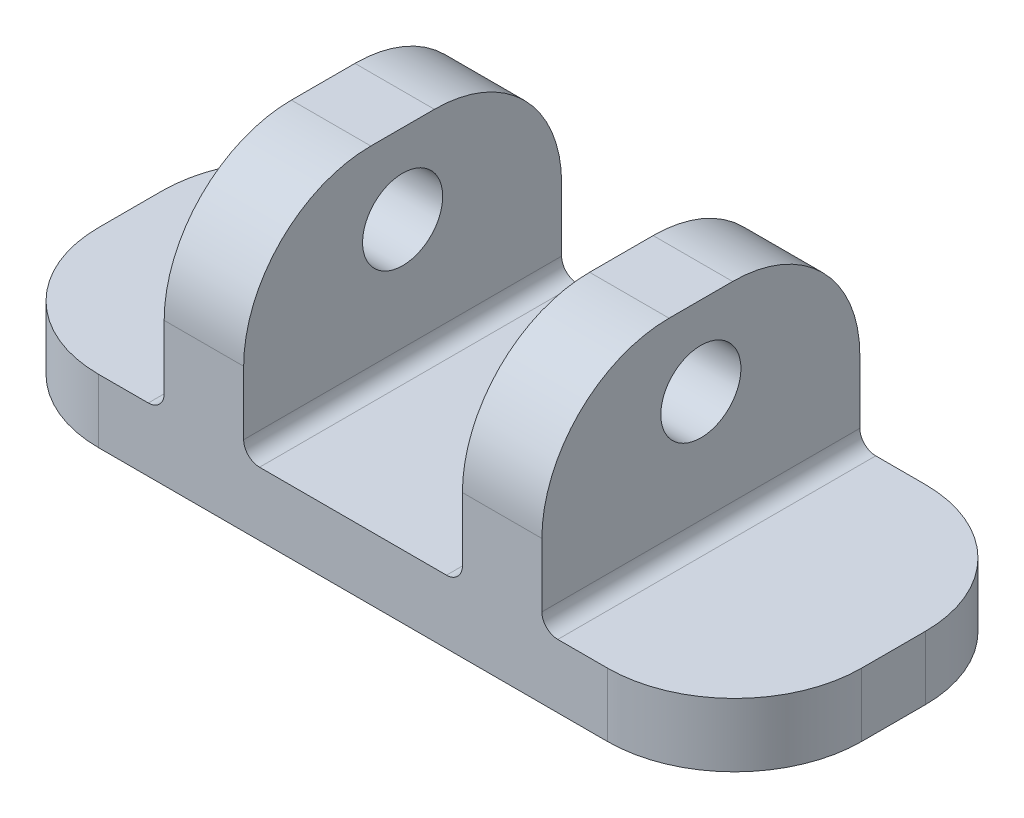
ISO-10303-21;
HEADER;
FILE_DESCRIPTION(('STEP AP214'),'2;1');
FILE_NAME('part.step','',(''),(''),'','','');
FILE_SCHEMA(('AUTOMOTIVE_DESIGN { 1 0 10303 214 1 1 1 1 }'));
ENDSEC;
DATA;
#1=APPLICATION_CONTEXT('core data for automotive mechanical design processes');
#2=APPLICATION_PROTOCOL_DEFINITION('international standard','automotive_design',2000,#1);
#3=PRODUCT_CONTEXT('',#1,'mechanical');
#4=PRODUCT('Part','Part','',(#3));
#5=PRODUCT_RELATED_PRODUCT_CATEGORY('part','',(#4));
#6=PRODUCT_DEFINITION_FORMATION('','',#4);
#7=PRODUCT_DEFINITION_CONTEXT('part definition',#1,'design');
#8=PRODUCT_DEFINITION('design','',#6,#7);
#9=PRODUCT_DEFINITION_SHAPE('','',#8);
#10=(LENGTH_UNIT() NAMED_UNIT(*) SI_UNIT(.MILLI.,.METRE.));
#11=(NAMED_UNIT(*) PLANE_ANGLE_UNIT() SI_UNIT($,.RADIAN.));
#12=(NAMED_UNIT(*) SI_UNIT($,.STERADIAN.) SOLID_ANGLE_UNIT());
#13=UNCERTAINTY_MEASURE_WITH_UNIT(LENGTH_MEASURE(1.E-05),#10,'distance_accuracy_value','');
#14=(GEOMETRIC_REPRESENTATION_CONTEXT(3) GLOBAL_UNCERTAINTY_ASSIGNED_CONTEXT((#13)) GLOBAL_UNIT_ASSIGNED_CONTEXT((#10,
#11,#12)) REPRESENTATION_CONTEXT('',''));
#15=CARTESIAN_POINT('',(0.,0.,0.));
#16=DIRECTION('',(0.,0.,1.));
#17=DIRECTION('',(1.,0.,0.));
#18=AXIS2_PLACEMENT_3D('',#15,#16,#17);
#19=CARTESIAN_POINT('',(10.922,7.9375,15.875));
#20=DIRECTION('',(1.,0.,0.));
#21=DIRECTION('',(0.,1.,0.));
#22=AXIS2_PLACEMENT_3D('',#19,#20,#21);
#23=PLANE('',#22);
#24=CARTESIAN_POINT('',(10.922,0.,0.));
#25=DIRECTION('',(1.,0.,0.));
#26=DIRECTION('',(0.,1.,0.));
#27=AXIS2_PLACEMENT_3D('',#24,#25,#26);
#28=CIRCLE('',#27,4.);
#29=CARTESIAN_POINT('',(10.922,4.,0.));
#30=VERTEX_POINT('',#29);
#31=EDGE_CURVE('E353',#30,#30,#28,.T.);
#32=ORIENTED_EDGE('',*,*,#31,.T.);
#33=EDGE_LOOP('',(#32));
#34=FACE_BOUND('',#33,.T.);
#35=DIRECTION('',(0.,-1.,0.));
#36=VECTOR('',#35,1.);
#37=CARTESIAN_POINT('',(10.922,7.9375,-15.875));
#38=LINE('',#37,#36);
#39=CARTESIAN_POINT('',(10.922,-4.7625,-15.875));
#40=VERTEX_POINT('',#39);
#41=CARTESIAN_POINT('',(10.922,-11.1125,-15.875));
#42=VERTEX_POINT('',#41);
#43=EDGE_CURVE('E349',#40,#42,#38,.T.);
#44=ORIENTED_EDGE('',*,*,#43,.T.);
#45=DIRECTION('',(0.,0.,-1.));
#46=VECTOR('',#45,1.);
#47=CARTESIAN_POINT('',(10.922,-11.1125,15.875));
#48=LINE('',#47,#46);
#49=CARTESIAN_POINT('',(10.922,-11.1125,15.875));
#50=VERTEX_POINT('',#49);
#51=EDGE_CURVE('E274',#42,#50,#48,.F.);
#52=ORIENTED_EDGE('',*,*,#51,.T.);
#53=DIRECTION('',(0.,-1.,0.));
#54=VECTOR('',#53,1.);
#55=CARTESIAN_POINT('',(10.922,7.9375,15.875));
#56=LINE('',#55,#54);
#57=CARTESIAN_POINT('',(10.922,-4.7625,15.875));
#58=VERTEX_POINT('',#57);
#59=EDGE_CURVE('E370',#58,#50,#56,.T.);
#60=ORIENTED_EDGE('',*,*,#59,.F.);
#61=CARTESIAN_POINT('',(10.922,-4.7625,3.175));
#62=DIRECTION('',(1.,0.,0.));
#63=DIRECTION('',(0.,1.,0.));
#64=AXIS2_PLACEMENT_3D('',#61,#62,#63);
#65=CIRCLE('',#64,12.7);
#66=CARTESIAN_POINT('',(10.922,7.9375,3.175));
#67=VERTEX_POINT('',#66);
#68=EDGE_CURVE('E249',#58,#67,#65,.F.);
#69=ORIENTED_EDGE('',*,*,#68,.T.);
#70=DIRECTION('',(0.,0.,-1.));
#71=VECTOR('',#70,1.);
#72=CARTESIAN_POINT('',(10.922,7.9375,15.875));
#73=LINE('',#72,#71);
#74=CARTESIAN_POINT('',(10.922,7.9375,-3.175));
#75=VERTEX_POINT('',#74);
#76=EDGE_CURVE('E348',#67,#75,#73,.T.);
#77=ORIENTED_EDGE('',*,*,#76,.T.);
#78=CARTESIAN_POINT('',(10.922,-4.7625,-3.175));
#79=DIRECTION('',(1.,0.,0.));
#80=DIRECTION('',(0.,1.,0.));
#81=AXIS2_PLACEMENT_3D('',#78,#79,#80);
#82=CIRCLE('',#81,12.7);
#83=EDGE_CURVE('E251',#75,#40,#82,.F.);
#84=ORIENTED_EDGE('',*,*,#83,.T.);
#85=EDGE_LOOP('',(#44,#52,#60,#69,#77,#84));
#86=FACE_BOUND('',#85,.T.);
#87=ADVANCED_FACE('F33',(#34,#86),#23,.F.);
#88=CARTESIAN_POINT('',(10.922,-12.7,15.875));
#89=DIRECTION('',(0.,-1.,0.));
#90=DIRECTION('',(0.,0.,-1.));
#91=AXIS2_PLACEMENT_3D('',#88,#89,#90);
#92=PLANE('',#91);
#93=DIRECTION('',(-1.,0.,0.));
#94=VECTOR('',#93,1.);
#95=CARTESIAN_POINT('',(10.922,-12.7,15.875));
#96=LINE('',#95,#94);
#97=CARTESIAN_POINT('',(9.3345,-12.7,15.875));
#98=VERTEX_POINT('',#97);
#99=CARTESIAN_POINT('',(-9.3345,-12.7,15.875));
#100=VERTEX_POINT('',#99);
#101=EDGE_CURVE('E430',#98,#100,#96,.T.);
#102=ORIENTED_EDGE('',*,*,#101,.F.);
#103=DIRECTION('',(0.,0.,-1.));
#104=VECTOR('',#103,1.);
#105=CARTESIAN_POINT('',(9.3345,-12.7,-15.875));
#106=LINE('',#105,#104);
#107=CARTESIAN_POINT('',(9.3345,-12.7,-15.875));
#108=VERTEX_POINT('',#107);
#109=EDGE_CURVE('E271',#98,#108,#106,.T.);
#110=ORIENTED_EDGE('',*,*,#109,.T.);
#111=DIRECTION('',(-1.,0.,0.));
#112=VECTOR('',#111,1.);
#113=CARTESIAN_POINT('',(10.922,-12.7,-15.875));
#114=LINE('',#113,#112);
#115=CARTESIAN_POINT('',(-9.3345,-12.7,-15.875));
#116=VERTEX_POINT('',#115);
#117=EDGE_CURVE('E352',#108,#116,#114,.T.);
#118=ORIENTED_EDGE('',*,*,#117,.T.);
#119=DIRECTION('',(0.,0.,-1.));
#120=VECTOR('',#119,1.);
#121=CARTESIAN_POINT('',(-9.3345,-12.7,15.875));
#122=LINE('',#121,#120);
#123=EDGE_CURVE('E269',#116,#100,#122,.F.);
#124=ORIENTED_EDGE('',*,*,#123,.T.);
#125=EDGE_LOOP('',(#102,#110,#118,#124));
#126=FACE_BOUND('',#125,.T.);
#127=ADVANCED_FACE('F461',(#126),#92,.F.);
#128=CARTESIAN_POINT('',(-10.922,7.9375,15.875));
#129=DIRECTION('',(-1.,0.,0.));
#130=DIRECTION('',(0.,-1.,0.));
#131=AXIS2_PLACEMENT_3D('',#128,#129,#130);
#132=PLANE('',#131);
#133=CARTESIAN_POINT('',(-10.922,0.,0.));
#134=DIRECTION('',(-1.,0.,0.));
#135=DIRECTION('',(0.,-1.,0.));
#136=AXIS2_PLACEMENT_3D('',#133,#134,#135);
#137=CIRCLE('',#136,4.);
#138=CARTESIAN_POINT('',(-10.922,-4.,0.));
#139=VERTEX_POINT('',#138);
#140=EDGE_CURVE('E707',#139,#139,#137,.T.);
#141=ORIENTED_EDGE('',*,*,#140,.T.);
#142=EDGE_LOOP('',(#141));
#143=FACE_BOUND('',#142,.T.);
#144=DIRECTION('',(0.,1.,0.));
#145=VECTOR('',#144,1.);
#146=CARTESIAN_POINT('',(-10.922,7.9375,15.875));
#147=LINE('',#146,#145);
#148=CARTESIAN_POINT('',(-10.922,-11.1125,15.875));
#149=VERTEX_POINT('',#148);
#150=CARTESIAN_POINT('',(-10.922,-4.7625,15.875));
#151=VERTEX_POINT('',#150);
#152=EDGE_CURVE('E433',#149,#151,#147,.T.);
#153=ORIENTED_EDGE('',*,*,#152,.F.);
#154=DIRECTION('',(0.,0.,-1.));
#155=VECTOR('',#154,1.);
#156=CARTESIAN_POINT('',(-10.922,-11.1125,-15.875));
#157=LINE('',#156,#155);
#158=CARTESIAN_POINT('',(-10.922,-11.1125,-15.875));
#159=VERTEX_POINT('',#158);
#160=EDGE_CURVE('E276',#149,#159,#157,.T.);
#161=ORIENTED_EDGE('',*,*,#160,.T.);
#162=DIRECTION('',(0.,1.,0.));
#163=VECTOR('',#162,1.);
#164=CARTESIAN_POINT('',(-10.922,7.9375,-15.875));
#165=LINE('',#164,#163);
#166=CARTESIAN_POINT('',(-10.922,-4.7625,-15.875));
#167=VERTEX_POINT('',#166);
#168=EDGE_CURVE('E356',#159,#167,#165,.T.);
#169=ORIENTED_EDGE('',*,*,#168,.T.);
#170=CARTESIAN_POINT('',(-10.922,-4.7625,-3.175));
#171=DIRECTION('',(-1.,0.,0.));
#172=DIRECTION('',(0.,-1.,0.));
#173=AXIS2_PLACEMENT_3D('',#170,#171,#172);
#174=CIRCLE('',#173,12.7);
#175=CARTESIAN_POINT('',(-10.922,7.9375,-3.175));
#176=VERTEX_POINT('',#175);
#177=EDGE_CURVE('E237',#167,#176,#174,.F.);
#178=ORIENTED_EDGE('',*,*,#177,.T.);
#179=DIRECTION('',(0.,0.,-1.));
#180=VECTOR('',#179,1.);
#181=CARTESIAN_POINT('',(-10.922,7.9375,15.875));
#182=LINE('',#181,#180);
#183=CARTESIAN_POINT('',(-10.922,7.9375,3.175));
#184=VERTEX_POINT('',#183);
#185=EDGE_CURVE('E216',#184,#176,#182,.T.);
#186=ORIENTED_EDGE('',*,*,#185,.F.);
#187=CARTESIAN_POINT('',(-10.922,-4.7625,3.175));
#188=DIRECTION('',(-1.,0.,0.));
#189=DIRECTION('',(0.,-1.,0.));
#190=AXIS2_PLACEMENT_3D('',#187,#188,#189);
#191=CIRCLE('',#190,12.7);
#192=EDGE_CURVE('E222',#184,#151,#191,.F.);
#193=ORIENTED_EDGE('',*,*,#192,.T.);
#194=EDGE_LOOP('',(#153,#161,#169,#178,#186,#193));
#195=FACE_BOUND('',#194,.T.);
#196=ADVANCED_FACE('F453',(#143,#195),#132,.F.);
#197=CARTESIAN_POINT('',(-10.922,7.9375,15.875));
#198=DIRECTION('',(0.,-1.,0.));
#199=DIRECTION('',(0.,0.,-1.));
#200=AXIS2_PLACEMENT_3D('',#197,#198,#199);
#201=PLANE('',#200);
#202=ORIENTED_EDGE('',*,*,#185,.T.);
#203=DIRECTION('',(-1.,0.,0.));
#204=VECTOR('',#203,1.);
#205=CARTESIAN_POINT('',(-18.8595,7.9375,-3.175));
#206=LINE('',#205,#204);
#207=CARTESIAN_POINT('',(-18.8595,7.9375,-3.175));
#208=VERTEX_POINT('',#207);
#209=EDGE_CURVE('E207',#176,#208,#206,.T.);
#210=ORIENTED_EDGE('',*,*,#209,.T.);
#211=DIRECTION('',(0.,0.,-1.));
#212=VECTOR('',#211,1.);
#213=CARTESIAN_POINT('',(-18.8595,7.9375,15.875));
#214=LINE('',#213,#212);
#215=CARTESIAN_POINT('',(-18.8595,7.9375,3.175));
#216=VERTEX_POINT('',#215);
#217=EDGE_CURVE('E199',#216,#208,#214,.T.);
#218=ORIENTED_EDGE('',*,*,#217,.F.);
#219=DIRECTION('',(-1.,0.,0.));
#220=VECTOR('',#219,1.);
#221=CARTESIAN_POINT('',(-10.922,7.9375,3.175));
#222=LINE('',#221,#220);
#223=EDGE_CURVE('E213',#216,#184,#222,.F.);
#224=ORIENTED_EDGE('',*,*,#223,.T.);
#225=EDGE_LOOP('',(#202,#210,#218,#224));
#226=FACE_BOUND('',#225,.T.);
#227=ADVANCED_FACE('F212',(#226),#201,.F.);
#228=CARTESIAN_POINT('',(-18.8595,7.9375,15.875));
#229=DIRECTION('',(1.,0.,0.));
#230=DIRECTION('',(0.,0.,-1.));
#231=AXIS2_PLACEMENT_3D('',#228,#229,#230);
#232=PLANE('',#231);
#233=CARTESIAN_POINT('',(-18.8595,0.,0.));
#234=DIRECTION('',(1.,0.,0.));
#235=DIRECTION('',(0.,0.,-1.));
#236=AXIS2_PLACEMENT_3D('',#233,#234,#235);
#237=CIRCLE('',#236,4.);
#238=CARTESIAN_POINT('',(-18.8595,0.,-4.));
#239=VERTEX_POINT('',#238);
#240=EDGE_CURVE('E709',#239,#239,#237,.T.);
#241=ORIENTED_EDGE('',*,*,#240,.T.);
#242=EDGE_LOOP('',(#241));
#243=FACE_BOUND('',#242,.T.);
#244=DIRECTION('',(0.,-1.,0.));
#245=VECTOR('',#244,1.);
#246=CARTESIAN_POINT('',(-18.8595,7.9375,-15.875));
#247=LINE('',#246,#245);
#248=CARTESIAN_POINT('',(-18.8595,-4.7625,-15.875));
#249=VERTEX_POINT('',#248);
#250=CARTESIAN_POINT('',(-18.8595,-11.1125,-15.875));
#251=VERTEX_POINT('',#250);
#252=EDGE_CURVE('E358',#249,#251,#247,.T.);
#253=ORIENTED_EDGE('',*,*,#252,.T.);
#254=DIRECTION('',(0.,0.,-1.));
#255=VECTOR('',#254,1.);
#256=CARTESIAN_POINT('',(-18.8595,-11.1125,15.875));
#257=LINE('',#256,#255);
#258=CARTESIAN_POINT('',(-18.8595,-11.1125,15.875));
#259=VERTEX_POINT('',#258);
#260=EDGE_CURVE('E261',#251,#259,#257,.F.);
#261=ORIENTED_EDGE('',*,*,#260,.T.);
#262=DIRECTION('',(0.,-1.,0.));
#263=VECTOR('',#262,1.);
#264=CARTESIAN_POINT('',(-18.8595,7.9375,15.875));
#265=LINE('',#264,#263);
#266=CARTESIAN_POINT('',(-18.8595,-4.7625,15.875));
#267=VERTEX_POINT('',#266);
#268=EDGE_CURVE('E201',#267,#259,#265,.T.);
#269=ORIENTED_EDGE('',*,*,#268,.F.);
#270=CARTESIAN_POINT('',(-18.8595,-4.7625,3.175));
#271=DIRECTION('',(1.,0.,0.));
#272=DIRECTION('',(0.,0.,-1.));
#273=AXIS2_PLACEMENT_3D('',#270,#271,#272);
#274=CIRCLE('',#273,12.7);
#275=EDGE_CURVE('E195',#267,#216,#274,.F.);
#276=ORIENTED_EDGE('',*,*,#275,.T.);
#277=ORIENTED_EDGE('',*,*,#217,.T.);
#278=CARTESIAN_POINT('',(-18.8595,-4.7625,-3.175));
#279=DIRECTION('',(1.,0.,0.));
#280=DIRECTION('',(0.,0.,-1.));
#281=AXIS2_PLACEMENT_3D('',#278,#279,#280);
#282=CIRCLE('',#281,12.7);
#283=EDGE_CURVE('E206',#208,#249,#282,.F.);
#284=ORIENTED_EDGE('',*,*,#283,.T.);
#285=EDGE_LOOP('',(#253,#261,#269,#276,#277,#284));
#286=FACE_BOUND('',#285,.T.);
#287=ADVANCED_FACE('F198',(#243,#286),#232,.F.);
#288=CARTESIAN_POINT('',(-18.8595,-12.7,15.875));
#289=DIRECTION('',(0.,-1.,0.));
#290=DIRECTION('',(1.,0.,0.));
#291=AXIS2_PLACEMENT_3D('',#288,#289,#290);
#292=PLANE('',#291);
#293=DIRECTION('',(-1.,0.,0.));
#294=VECTOR('',#293,1.);
#295=CARTESIAN_POINT('',(-18.8595,-12.7,-15.875));
#296=LINE('',#295,#294);
#297=CARTESIAN_POINT('',(-20.447,-12.7,-15.875));
#298=VERTEX_POINT('',#297);
#299=CARTESIAN_POINT('',(-25.4,-12.7,-15.875));
#300=VERTEX_POINT('',#299);
#301=EDGE_CURVE('E360',#298,#300,#296,.T.);
#302=ORIENTED_EDGE('',*,*,#301,.T.);
#303=CARTESIAN_POINT('',(-25.4,-12.7,-3.175));
#304=DIRECTION('',(0.,-1.,0.));
#305=DIRECTION('',(1.,0.,0.));
#306=AXIS2_PLACEMENT_3D('',#303,#304,#305);
#307=CIRCLE('',#306,12.7);
#308=CARTESIAN_POINT('',(-38.1,-12.7,-3.175));
#309=VERTEX_POINT('',#308);
#310=EDGE_CURVE('E315',#300,#309,#307,.F.);
#311=ORIENTED_EDGE('',*,*,#310,.T.);
#312=DIRECTION('',(0.,0.,-1.));
#313=VECTOR('',#312,1.);
#314=CARTESIAN_POINT('',(-38.1,-12.7,15.875));
#315=LINE('',#314,#313);
#316=CARTESIAN_POINT('',(-38.1,-12.7,3.175));
#317=VERTEX_POINT('',#316);
#318=EDGE_CURVE('E217',#317,#309,#315,.T.);
#319=ORIENTED_EDGE('',*,*,#318,.F.);
#320=CARTESIAN_POINT('',(-25.4,-12.7,3.175));
#321=DIRECTION('',(0.,-1.,0.));
#322=DIRECTION('',(1.,0.,0.));
#323=AXIS2_PLACEMENT_3D('',#320,#321,#322);
#324=CIRCLE('',#323,12.7);
#325=CARTESIAN_POINT('',(-25.4,-12.7,15.875));
#326=VERTEX_POINT('',#325);
#327=EDGE_CURVE('E313',#317,#326,#324,.F.);
#328=ORIENTED_EDGE('',*,*,#327,.T.);
#329=DIRECTION('',(-1.,0.,0.));
#330=VECTOR('',#329,1.);
#331=CARTESIAN_POINT('',(-18.8595,-12.7,15.875));
#332=LINE('',#331,#330);
#333=CARTESIAN_POINT('',(-20.447,-12.7,15.875));
#334=VERTEX_POINT('',#333);
#335=EDGE_CURVE('E331',#334,#326,#332,.T.);
#336=ORIENTED_EDGE('',*,*,#335,.F.);
#337=DIRECTION('',(0.,0.,-1.));
#338=VECTOR('',#337,1.);
#339=CARTESIAN_POINT('',(-20.447,-12.7,-15.875));
#340=LINE('',#339,#338);
#341=EDGE_CURVE('E258',#334,#298,#340,.T.);
#342=ORIENTED_EDGE('',*,*,#341,.T.);
#343=EDGE_LOOP('',(#302,#311,#319,#328,#336,#342));
#344=FACE_BOUND('',#343,.T.);
#345=ADVANCED_FACE('F443',(#344),#292,.F.);
#346=CARTESIAN_POINT('',(-38.1,-12.7,15.875));
#347=DIRECTION('',(1.,0.,0.));
#348=DIRECTION('',(0.,1.,0.));
#349=AXIS2_PLACEMENT_3D('',#346,#347,#348);
#350=PLANE('',#349);
#351=ORIENTED_EDGE('',*,*,#318,.T.);
#352=DIRECTION('',(0.,-1.,0.));
#353=VECTOR('',#352,1.);
#354=CARTESIAN_POINT('',(-38.1,-19.05,-3.175));
#355=LINE('',#354,#353);
#356=CARTESIAN_POINT('',(-38.1,-19.05,-3.175));
#357=VERTEX_POINT('',#356);
#358=EDGE_CURVE('E298',#309,#357,#355,.T.);
#359=ORIENTED_EDGE('',*,*,#358,.T.);
#360=DIRECTION('',(0.,0.,-1.));
#361=VECTOR('',#360,1.);
#362=CARTESIAN_POINT('',(-38.1,-19.05,15.875));
#363=LINE('',#362,#361);
#364=CARTESIAN_POINT('',(-38.1,-19.05,3.175));
#365=VERTEX_POINT('',#364);
#366=EDGE_CURVE('E382',#365,#357,#363,.T.);
#367=ORIENTED_EDGE('',*,*,#366,.F.);
#368=DIRECTION('',(0.,-1.,0.));
#369=VECTOR('',#368,1.);
#370=CARTESIAN_POINT('',(-38.1,-12.7,3.175));
#371=LINE('',#370,#369);
#372=EDGE_CURVE('E296',#365,#317,#371,.F.);
#373=ORIENTED_EDGE('',*,*,#372,.T.);
#374=EDGE_LOOP('',(#351,#359,#367,#373));
#375=FACE_BOUND('',#374,.T.);
#376=ADVANCED_FACE('F388',(#375),#350,.F.);
#377=CARTESIAN_POINT('',(38.1,-19.05,15.875));
#378=DIRECTION('',(0.,1.,0.));
#379=DIRECTION('',(0.,0.,1.));
#380=AXIS2_PLACEMENT_3D('',#377,#378,#379);
#381=PLANE('',#380);
#382=ORIENTED_EDGE('',*,*,#366,.T.);
#383=CARTESIAN_POINT('',(-25.4,-19.05,-3.175));
#384=DIRECTION('',(0.,1.,0.));
#385=DIRECTION('',(0.,0.,1.));
#386=AXIS2_PLACEMENT_3D('',#383,#384,#385);
#387=CIRCLE('',#386,12.7);
#388=CARTESIAN_POINT('',(-25.4,-19.05,-15.875));
#389=VERTEX_POINT('',#388);
#390=EDGE_CURVE('E307',#357,#389,#387,.F.);
#391=ORIENTED_EDGE('',*,*,#390,.T.);
#392=DIRECTION('',(1.,0.,0.));
#393=VECTOR('',#392,1.);
#394=CARTESIAN_POINT('',(38.1,-19.05,-15.875));
#395=LINE('',#394,#393);
#396=CARTESIAN_POINT('',(25.4,-19.05,-15.875));
#397=VERTEX_POINT('',#396);
#398=EDGE_CURVE('E363',#389,#397,#395,.T.);
#399=ORIENTED_EDGE('',*,*,#398,.T.);
#400=CARTESIAN_POINT('',(25.4,-19.05,-3.175));
#401=DIRECTION('',(0.,1.,0.));
#402=DIRECTION('',(0.,0.,1.));
#403=AXIS2_PLACEMENT_3D('',#400,#401,#402);
#404=CIRCLE('',#403,12.7);
#405=CARTESIAN_POINT('',(38.1,-19.05,-3.175));
#406=VERTEX_POINT('',#405);
#407=EDGE_CURVE('E305',#397,#406,#404,.F.);
#408=ORIENTED_EDGE('',*,*,#407,.T.);
#409=DIRECTION('',(0.,0.,-1.));
#410=VECTOR('',#409,1.);
#411=CARTESIAN_POINT('',(38.1,-19.05,15.875));
#412=LINE('',#411,#410);
#413=CARTESIAN_POINT('',(38.1,-19.05,3.175));
#414=VERTEX_POINT('',#413);
#415=EDGE_CURVE('E379',#414,#406,#412,.T.);
#416=ORIENTED_EDGE('',*,*,#415,.F.);
#417=CARTESIAN_POINT('',(25.4,-19.05,3.175));
#418=DIRECTION('',(0.,1.,0.));
#419=DIRECTION('',(0.,0.,1.));
#420=AXIS2_PLACEMENT_3D('',#417,#418,#419);
#421=CIRCLE('',#420,12.7);
#422=CARTESIAN_POINT('',(25.4,-19.05,15.875));
#423=VERTEX_POINT('',#422);
#424=EDGE_CURVE('E303',#414,#423,#421,.F.);
#425=ORIENTED_EDGE('',*,*,#424,.T.);
#426=DIRECTION('',(1.,0.,0.));
#427=VECTOR('',#426,1.);
#428=CARTESIAN_POINT('',(38.1,-19.05,15.875));
#429=LINE('',#428,#427);
#430=CARTESIAN_POINT('',(-25.4,-19.05,15.875));
#431=VERTEX_POINT('',#430);
#432=EDGE_CURVE('E329',#431,#423,#429,.T.);
#433=ORIENTED_EDGE('',*,*,#432,.F.);
#434=CARTESIAN_POINT('',(-25.4,-19.05,3.175));
#435=DIRECTION('',(0.,1.,0.));
#436=DIRECTION('',(0.,0.,1.));
#437=AXIS2_PLACEMENT_3D('',#434,#435,#436);
#438=CIRCLE('',#437,12.7);
#439=EDGE_CURVE('E301',#431,#365,#438,.F.);
#440=ORIENTED_EDGE('',*,*,#439,.T.);
#441=EDGE_LOOP('',(#382,#391,#399,#408,#416,#425,#433,#440));
#442=FACE_BOUND('',#441,.T.);
#443=ADVANCED_FACE('F336',(#442),#381,.F.);
#444=CARTESIAN_POINT('',(38.1,-12.7,15.875));
#445=DIRECTION('',(-1.,0.,0.));
#446=DIRECTION('',(0.,-1.,0.));
#447=AXIS2_PLACEMENT_3D('',#444,#445,#446);
#448=PLANE('',#447);
#449=ORIENTED_EDGE('',*,*,#415,.T.);
#450=DIRECTION('',(0.,1.,0.));
#451=VECTOR('',#450,1.);
#452=CARTESIAN_POINT('',(38.1,-12.7,-3.175));
#453=LINE('',#452,#451);
#454=CARTESIAN_POINT('',(38.1,-12.7,-3.175));
#455=VERTEX_POINT('',#454);
#456=EDGE_CURVE('E319',#406,#455,#453,.T.);
#457=ORIENTED_EDGE('',*,*,#456,.T.);
#458=DIRECTION('',(0.,0.,-1.));
#459=VECTOR('',#458,1.);
#460=CARTESIAN_POINT('',(38.1,-12.7,15.875));
#461=LINE('',#460,#459);
#462=CARTESIAN_POINT('',(38.1,-12.7,3.175));
#463=VERTEX_POINT('',#462);
#464=EDGE_CURVE('E376',#463,#455,#461,.T.);
#465=ORIENTED_EDGE('',*,*,#464,.F.);
#466=DIRECTION('',(0.,1.,0.));
#467=VECTOR('',#466,1.);
#468=CARTESIAN_POINT('',(38.1,-12.7,3.175));
#469=LINE('',#468,#467);
#470=EDGE_CURVE('E317',#463,#414,#469,.F.);
#471=ORIENTED_EDGE('',*,*,#470,.T.);
#472=EDGE_LOOP('',(#449,#457,#465,#471));
#473=FACE_BOUND('',#472,.T.);
#474=ADVANCED_FACE('F403',(#473),#448,.F.);
#475=CARTESIAN_POINT('',(18.8595,-12.7,15.875));
#476=DIRECTION('',(0.,-1.,0.));
#477=DIRECTION('',(1.,0.,0.));
#478=AXIS2_PLACEMENT_3D('',#475,#476,#477);
#479=PLANE('',#478);
#480=ORIENTED_EDGE('',*,*,#464,.T.);
#481=CARTESIAN_POINT('',(25.4,-12.7,-3.175));
#482=DIRECTION('',(0.,-1.,0.));
#483=DIRECTION('',(1.,0.,0.));
#484=AXIS2_PLACEMENT_3D('',#481,#482,#483);
#485=CIRCLE('',#484,12.7);
#486=CARTESIAN_POINT('',(25.4,-12.7,-15.875));
#487=VERTEX_POINT('',#486);
#488=EDGE_CURVE('E55',#455,#487,#485,.F.);
#489=ORIENTED_EDGE('',*,*,#488,.T.);
#490=DIRECTION('',(-1.,0.,0.));
#491=VECTOR('',#490,1.);
#492=CARTESIAN_POINT('',(18.8595,-12.7,-15.875));
#493=LINE('',#492,#491);
#494=CARTESIAN_POINT('',(20.447,-12.7,-15.875));
#495=VERTEX_POINT('',#494);
#496=EDGE_CURVE('E366',#487,#495,#493,.T.);
#497=ORIENTED_EDGE('',*,*,#496,.T.);
#498=DIRECTION('',(0.,0.,-1.));
#499=VECTOR('',#498,1.);
#500=CARTESIAN_POINT('',(20.447,-12.7,15.875));
#501=LINE('',#500,#499);
#502=CARTESIAN_POINT('',(20.447,-12.7,15.875));
#503=VERTEX_POINT('',#502);
#504=EDGE_CURVE('E266',#495,#503,#501,.F.);
#505=ORIENTED_EDGE('',*,*,#504,.T.);
#506=DIRECTION('',(-1.,0.,0.));
#507=VECTOR('',#506,1.);
#508=CARTESIAN_POINT('',(18.8595,-12.7,15.875));
#509=LINE('',#508,#507);
#510=CARTESIAN_POINT('',(25.4,-12.7,15.875));
#511=VERTEX_POINT('',#510);
#512=EDGE_CURVE('E340',#511,#503,#509,.T.);
#513=ORIENTED_EDGE('',*,*,#512,.F.);
#514=CARTESIAN_POINT('',(25.4,-12.7,3.175));
#515=DIRECTION('',(0.,-1.,0.));
#516=DIRECTION('',(1.,0.,0.));
#517=AXIS2_PLACEMENT_3D('',#514,#515,#516);
#518=CIRCLE('',#517,12.7);
#519=EDGE_CURVE('E48',#511,#463,#518,.F.);
#520=ORIENTED_EDGE('',*,*,#519,.T.);
#521=EDGE_LOOP('',(#480,#489,#497,#505,#513,#520));
#522=FACE_BOUND('',#521,.T.);
#523=ADVANCED_FACE('F408',(#522),#479,.F.);
#524=CARTESIAN_POINT('',(18.8595,7.9375,15.875));
#525=DIRECTION('',(-1.,0.,0.));
#526=DIRECTION('',(0.,0.,1.));
#527=AXIS2_PLACEMENT_3D('',#524,#525,#526);
#528=PLANE('',#527);
#529=CARTESIAN_POINT('',(18.8595,0.,0.));
#530=DIRECTION('',(-1.,0.,0.));
#531=DIRECTION('',(0.,0.,1.));
#532=AXIS2_PLACEMENT_3D('',#529,#530,#531);
#533=CIRCLE('',#532,4.);
#534=CARTESIAN_POINT('',(18.8595,0.,4.));
#535=VERTEX_POINT('',#534);
#536=EDGE_CURVE('E227',#535,#535,#533,.T.);
#537=ORIENTED_EDGE('',*,*,#536,.T.);
#538=EDGE_LOOP('',(#537));
#539=FACE_BOUND('',#538,.T.);
#540=DIRECTION('',(0.,1.,0.));
#541=VECTOR('',#540,1.);
#542=CARTESIAN_POINT('',(18.8595,7.9375,15.875));
#543=LINE('',#542,#541);
#544=CARTESIAN_POINT('',(18.8595,-11.1125,15.875));
#545=VERTEX_POINT('',#544);
#546=CARTESIAN_POINT('',(18.8595,-4.7625,15.875));
#547=VERTEX_POINT('',#546);
#548=EDGE_CURVE('E342',#545,#547,#543,.T.);
#549=ORIENTED_EDGE('',*,*,#548,.F.);
#550=DIRECTION('',(0.,0.,-1.));
#551=VECTOR('',#550,1.);
#552=CARTESIAN_POINT('',(18.8595,-11.1125,-15.875));
#553=LINE('',#552,#551);
#554=CARTESIAN_POINT('',(18.8595,-11.1125,-15.875));
#555=VERTEX_POINT('',#554);
#556=EDGE_CURVE('E263',#545,#555,#553,.T.);
#557=ORIENTED_EDGE('',*,*,#556,.T.);
#558=DIRECTION('',(0.,1.,0.));
#559=VECTOR('',#558,1.);
#560=CARTESIAN_POINT('',(18.8595,7.9375,-15.875));
#561=LINE('',#560,#559);
#562=CARTESIAN_POINT('',(18.8595,-4.7625,-15.875));
#563=VERTEX_POINT('',#562);
#564=EDGE_CURVE('E368',#555,#563,#561,.T.);
#565=ORIENTED_EDGE('',*,*,#564,.T.);
#566=CARTESIAN_POINT('',(18.8595,-4.7625,-3.175));
#567=DIRECTION('',(-1.,0.,0.));
#568=DIRECTION('',(0.,0.,1.));
#569=AXIS2_PLACEMENT_3D('',#566,#567,#568);
#570=CIRCLE('',#569,12.7);
#571=CARTESIAN_POINT('',(18.8595,7.9375,-3.175));
#572=VERTEX_POINT('',#571);
#573=EDGE_CURVE('E256',#563,#572,#570,.F.);
#574=ORIENTED_EDGE('',*,*,#573,.T.);
#575=DIRECTION('',(0.,0.,-1.));
#576=VECTOR('',#575,1.);
#577=CARTESIAN_POINT('',(18.8595,7.9375,15.875));
#578=LINE('',#577,#576);
#579=CARTESIAN_POINT('',(18.8595,7.9375,3.175));
#580=VERTEX_POINT('',#579);
#581=EDGE_CURVE('E373',#580,#572,#578,.T.);
#582=ORIENTED_EDGE('',*,*,#581,.F.);
#583=CARTESIAN_POINT('',(18.8595,-4.7625,3.175));
#584=DIRECTION('',(-1.,0.,0.));
#585=DIRECTION('',(0.,0.,1.));
#586=AXIS2_PLACEMENT_3D('',#583,#584,#585);
#587=CIRCLE('',#586,12.7);
#588=EDGE_CURVE('E253',#580,#547,#587,.F.);
#589=ORIENTED_EDGE('',*,*,#588,.T.);
#590=EDGE_LOOP('',(#549,#557,#565,#574,#582,#589));
#591=FACE_BOUND('',#590,.T.);
#592=ADVANCED_FACE('F416',(#539,#591),#528,.F.);
#593=CARTESIAN_POINT('',(10.922,7.9375,15.875));
#594=DIRECTION('',(0.,-1.,0.));
#595=DIRECTION('',(0.,0.,-1.));
#596=AXIS2_PLACEMENT_3D('',#593,#594,#595);
#597=PLANE('',#596);
#598=ORIENTED_EDGE('',*,*,#581,.T.);
#599=DIRECTION('',(-1.,0.,0.));
#600=VECTOR('',#599,1.);
#601=CARTESIAN_POINT('',(10.922,7.9375,-3.175));
#602=LINE('',#601,#600);
#603=EDGE_CURVE('E246',#572,#75,#602,.T.);
#604=ORIENTED_EDGE('',*,*,#603,.T.);
#605=ORIENTED_EDGE('',*,*,#76,.F.);
#606=DIRECTION('',(-1.,0.,0.));
#607=VECTOR('',#606,1.);
#608=CARTESIAN_POINT('',(10.922,7.9375,3.175));
#609=LINE('',#608,#607);
#610=EDGE_CURVE('E244',#67,#580,#609,.F.);
#611=ORIENTED_EDGE('',*,*,#610,.T.);
#612=EDGE_LOOP('',(#598,#604,#605,#611));
#613=FACE_BOUND('',#612,.T.);
#614=ADVANCED_FACE('F472',(#613),#597,.F.);
#615=CARTESIAN_POINT('',(10.922,-12.7,15.875));
#616=DIRECTION('',(0.,0.,-1.));
#617=DIRECTION('',(-1.,0.,0.));
#618=AXIS2_PLACEMENT_3D('',#615,#616,#617);
#619=PLANE('',#618);
#620=ORIENTED_EDGE('',*,*,#432,.T.);
#621=DIRECTION('',(0.,1.,0.));
#622=VECTOR('',#621,1.);
#623=CARTESIAN_POINT('',(25.4,-12.7,15.875));
#624=LINE('',#623,#622);
#625=EDGE_CURVE('E11',#423,#511,#624,.T.);
#626=ORIENTED_EDGE('',*,*,#625,.T.);
#627=ORIENTED_EDGE('',*,*,#512,.T.);
#628=CARTESIAN_POINT('',(20.447,-11.1125,15.875));
#629=DIRECTION('',(0.,0.,-1.));
#630=DIRECTION('',(-1.,0.,0.));
#631=AXIS2_PLACEMENT_3D('',#628,#629,#630);
#632=CIRCLE('',#631,1.5875);
#633=EDGE_CURVE('E286',#503,#545,#632,.T.);
#634=ORIENTED_EDGE('',*,*,#633,.T.);
#635=ORIENTED_EDGE('',*,*,#548,.T.);
#636=DIRECTION('',(-1.,0.,0.));
#637=VECTOR('',#636,1.);
#638=CARTESIAN_POINT('',(10.922,-4.7625,15.875));
#639=LINE('',#638,#637);
#640=EDGE_CURVE('E239',#547,#58,#639,.T.);
#641=ORIENTED_EDGE('',*,*,#640,.T.);
#642=ORIENTED_EDGE('',*,*,#59,.T.);
#643=CARTESIAN_POINT('',(9.3345,-11.1125,15.875));
#644=DIRECTION('',(0.,0.,-1.));
#645=DIRECTION('',(-1.,0.,0.));
#646=AXIS2_PLACEMENT_3D('',#643,#644,#645);
#647=CIRCLE('',#646,1.5875);
#648=EDGE_CURVE('E290',#50,#98,#647,.T.);
#649=ORIENTED_EDGE('',*,*,#648,.T.);
#650=ORIENTED_EDGE('',*,*,#101,.T.);
#651=CARTESIAN_POINT('',(-9.3345,-11.1125,15.875));
#652=DIRECTION('',(0.,0.,-1.));
#653=DIRECTION('',(-1.,0.,0.));
#654=AXIS2_PLACEMENT_3D('',#651,#652,#653);
#655=CIRCLE('',#654,1.5875);
#656=EDGE_CURVE('E294',#100,#149,#655,.T.);
#657=ORIENTED_EDGE('',*,*,#656,.T.);
#658=ORIENTED_EDGE('',*,*,#152,.T.);
#659=DIRECTION('',(-1.,0.,0.));
#660=VECTOR('',#659,1.);
#661=CARTESIAN_POINT('',(10.922,-4.7625,15.875));
#662=LINE('',#661,#660);
#663=EDGE_CURVE('E242',#151,#267,#662,.T.);
#664=ORIENTED_EDGE('',*,*,#663,.T.);
#665=ORIENTED_EDGE('',*,*,#268,.T.);
#666=CARTESIAN_POINT('',(-20.447,-11.1125,15.875));
#667=DIRECTION('',(0.,0.,-1.));
#668=DIRECTION('',(-1.,0.,0.));
#669=AXIS2_PLACEMENT_3D('',#666,#667,#668);
#670=CIRCLE('',#669,1.5875);
#671=EDGE_CURVE('E281',#259,#334,#670,.T.);
#672=ORIENTED_EDGE('',*,*,#671,.T.);
#673=ORIENTED_EDGE('',*,*,#335,.T.);
#674=DIRECTION('',(0.,-1.,0.));
#675=VECTOR('',#674,1.);
#676=CARTESIAN_POINT('',(-25.4,-12.7,15.875));
#677=LINE('',#676,#675);
#678=EDGE_CURVE('E41',#326,#431,#677,.T.);
#679=ORIENTED_EDGE('',*,*,#678,.T.);
#680=EDGE_LOOP('',(#620,#626,#627,#634,#635,#641,#642,#649,#650,#657,#658,#664,#665,#672,#673,#679));
#681=FACE_BOUND('',#680,.T.);
#682=ADVANCED_FACE('F328',(#681),#619,.F.);
#683=CARTESIAN_POINT('',(10.922,-12.7,-15.875));
#684=DIRECTION('',(0.,0.,-1.));
#685=DIRECTION('',(-1.,0.,0.));
#686=AXIS2_PLACEMENT_3D('',#683,#684,#685);
#687=PLANE('',#686);
#688=ORIENTED_EDGE('',*,*,#398,.F.);
#689=DIRECTION('',(0.,-1.,0.));
#690=VECTOR('',#689,1.);
#691=CARTESIAN_POINT('',(-25.4,-12.7,-15.875));
#692=LINE('',#691,#690);
#693=EDGE_CURVE('E311',#389,#300,#692,.F.);
#694=ORIENTED_EDGE('',*,*,#693,.T.);
#695=ORIENTED_EDGE('',*,*,#301,.F.);
#696=CARTESIAN_POINT('',(-20.447,-11.1125,-15.875));
#697=DIRECTION('',(0.,0.,-1.));
#698=DIRECTION('',(-1.,0.,0.));
#699=AXIS2_PLACEMENT_3D('',#696,#697,#698);
#700=CIRCLE('',#699,1.5875);
#701=EDGE_CURVE('E279',#298,#251,#700,.F.);
#702=ORIENTED_EDGE('',*,*,#701,.T.);
#703=ORIENTED_EDGE('',*,*,#252,.F.);
#704=DIRECTION('',(-1.,0.,0.));
#705=VECTOR('',#704,1.);
#706=CARTESIAN_POINT('',(-10.922,-4.7625,-15.875));
#707=LINE('',#706,#705);
#708=EDGE_CURVE('E233',#249,#167,#707,.F.);
#709=ORIENTED_EDGE('',*,*,#708,.T.);
#710=ORIENTED_EDGE('',*,*,#168,.F.);
#711=CARTESIAN_POINT('',(-9.3345,-11.1125,-15.875));
#712=DIRECTION('',(0.,0.,-1.));
#713=DIRECTION('',(-1.,0.,0.));
#714=AXIS2_PLACEMENT_3D('',#711,#712,#713);
#715=CIRCLE('',#714,1.5875);
#716=EDGE_CURVE('E292',#159,#116,#715,.F.);
#717=ORIENTED_EDGE('',*,*,#716,.T.);
#718=ORIENTED_EDGE('',*,*,#117,.F.);
#719=CARTESIAN_POINT('',(9.3345,-11.1125,-15.875));
#720=DIRECTION('',(0.,0.,-1.));
#721=DIRECTION('',(-1.,0.,0.));
#722=AXIS2_PLACEMENT_3D('',#719,#720,#721);
#723=CIRCLE('',#722,1.5875);
#724=EDGE_CURVE('E288',#108,#42,#723,.F.);
#725=ORIENTED_EDGE('',*,*,#724,.T.);
#726=ORIENTED_EDGE('',*,*,#43,.F.);
#727=DIRECTION('',(-1.,0.,0.));
#728=VECTOR('',#727,1.);
#729=CARTESIAN_POINT('',(18.8595,-4.7625,-15.875));
#730=LINE('',#729,#728);
#731=EDGE_CURVE('E230',#40,#563,#730,.F.);
#732=ORIENTED_EDGE('',*,*,#731,.T.);
#733=ORIENTED_EDGE('',*,*,#564,.F.);
#734=CARTESIAN_POINT('',(20.447,-11.1125,-15.875));
#735=DIRECTION('',(0.,0.,-1.));
#736=DIRECTION('',(-1.,0.,0.));
#737=AXIS2_PLACEMENT_3D('',#734,#735,#736);
#738=CIRCLE('',#737,1.5875);
#739=EDGE_CURVE('E283',#555,#495,#738,.F.);
#740=ORIENTED_EDGE('',*,*,#739,.T.);
#741=ORIENTED_EDGE('',*,*,#496,.F.);
#742=DIRECTION('',(0.,1.,0.));
#743=VECTOR('',#742,1.);
#744=CARTESIAN_POINT('',(25.4,-19.05,-15.875));
#745=LINE('',#744,#743);
#746=EDGE_CURVE('E309',#487,#397,#745,.F.);
#747=ORIENTED_EDGE('',*,*,#746,.T.);
#748=EDGE_LOOP('',(#688,#694,#695,#702,#703,#709,#710,#717,#718,#725,#726,#732,#733,#740,#741,#747));
#749=FACE_BOUND('',#748,.T.);
#750=ADVANCED_FACE('F398',(#749),#687,.T.);
#751=CARTESIAN_POINT('',(-38.1,0.,0.));
#752=DIRECTION('',(1.,0.,0.));
#753=DIRECTION('',(0.,0.,-1.));
#754=AXIS2_PLACEMENT_3D('',#751,#752,#753);
#755=CYLINDRICAL_SURFACE('',#754,4.);
#756=ORIENTED_EDGE('',*,*,#536,.F.);
#757=EDGE_LOOP('',(#756));
#758=FACE_BOUND('',#757,.T.);
#759=ORIENTED_EDGE('',*,*,#31,.F.);
#760=EDGE_LOOP('',(#759));
#761=FACE_BOUND('',#760,.T.);
#762=ADVANCED_FACE('F545',(#758,#761),#755,.F.);
#763=ORIENTED_EDGE('',*,*,#240,.F.);
#764=EDGE_LOOP('',(#763));
#765=FACE_BOUND('',#764,.T.);
#766=ORIENTED_EDGE('',*,*,#140,.F.);
#767=EDGE_LOOP('',(#766));
#768=FACE_BOUND('',#767,.T.);
#769=ADVANCED_FACE('F495',(#765,#768),#755,.F.);
#770=CARTESIAN_POINT('',(-10.922,-4.7625,-3.175));
#771=DIRECTION('',(1.,0.,0.));
#772=DIRECTION('',(0.,0.,-1.));
#773=AXIS2_PLACEMENT_3D('',#770,#771,#772);
#774=CYLINDRICAL_SURFACE('',#773,12.7);
#775=ORIENTED_EDGE('',*,*,#177,.F.);
#776=ORIENTED_EDGE('',*,*,#708,.F.);
#777=ORIENTED_EDGE('',*,*,#283,.F.);
#778=ORIENTED_EDGE('',*,*,#209,.F.);
#779=EDGE_LOOP('',(#775,#776,#777,#778));
#780=FACE_BOUND('',#779,.T.);
#781=ADVANCED_FACE('F448',(#780),#774,.T.);
#782=CARTESIAN_POINT('',(10.922,-4.7625,3.175));
#783=DIRECTION('',(-1.,0.,0.));
#784=DIRECTION('',(0.,0.,1.));
#785=AXIS2_PLACEMENT_3D('',#782,#783,#784);
#786=CYLINDRICAL_SURFACE('',#785,12.7);
#787=ORIENTED_EDGE('',*,*,#192,.F.);
#788=ORIENTED_EDGE('',*,*,#223,.F.);
#789=ORIENTED_EDGE('',*,*,#275,.F.);
#790=ORIENTED_EDGE('',*,*,#663,.F.);
#791=EDGE_LOOP('',(#787,#788,#789,#790));
#792=FACE_BOUND('',#791,.T.);
#793=ADVANCED_FACE('F220',(#792),#786,.T.);
#794=CARTESIAN_POINT('',(10.922,-4.7625,-3.175));
#795=DIRECTION('',(1.,0.,0.));
#796=DIRECTION('',(0.,0.,-1.));
#797=AXIS2_PLACEMENT_3D('',#794,#795,#796);
#798=CYLINDRICAL_SURFACE('',#797,12.7);
#799=ORIENTED_EDGE('',*,*,#573,.F.);
#800=ORIENTED_EDGE('',*,*,#731,.F.);
#801=ORIENTED_EDGE('',*,*,#83,.F.);
#802=ORIENTED_EDGE('',*,*,#603,.F.);
#803=EDGE_LOOP('',(#799,#800,#801,#802));
#804=FACE_BOUND('',#803,.T.);
#805=ADVANCED_FACE('F470',(#804),#798,.T.);
#806=CARTESIAN_POINT('',(10.922,-4.7625,3.175));
#807=DIRECTION('',(-1.,0.,0.));
#808=DIRECTION('',(0.,0.,1.));
#809=AXIS2_PLACEMENT_3D('',#806,#807,#808);
#810=CYLINDRICAL_SURFACE('',#809,12.7);
#811=ORIENTED_EDGE('',*,*,#588,.F.);
#812=ORIENTED_EDGE('',*,*,#610,.F.);
#813=ORIENTED_EDGE('',*,*,#68,.F.);
#814=ORIENTED_EDGE('',*,*,#640,.F.);
#815=EDGE_LOOP('',(#811,#812,#813,#814));
#816=FACE_BOUND('',#815,.T.);
#817=ADVANCED_FACE('F423',(#816),#810,.T.);
#818=CARTESIAN_POINT('',(-20.447,-11.1125,15.875));
#819=DIRECTION('',(0.,0.,1.));
#820=DIRECTION('',(1.,0.,0.));
#821=AXIS2_PLACEMENT_3D('',#818,#819,#820);
#822=CYLINDRICAL_SURFACE('',#821,1.5875);
#823=ORIENTED_EDGE('',*,*,#671,.F.);
#824=ORIENTED_EDGE('',*,*,#260,.F.);
#825=ORIENTED_EDGE('',*,*,#701,.F.);
#826=ORIENTED_EDGE('',*,*,#341,.F.);
#827=EDGE_LOOP('',(#823,#824,#825,#826));
#828=FACE_BOUND('',#827,.T.);
#829=ADVANCED_FACE('F442',(#828),#822,.F.);
#830=CARTESIAN_POINT('',(20.447,-11.1125,15.875));
#831=DIRECTION('',(0.,0.,1.));
#832=DIRECTION('',(1.,0.,0.));
#833=AXIS2_PLACEMENT_3D('',#830,#831,#832);
#834=CYLINDRICAL_SURFACE('',#833,1.5875);
#835=ORIENTED_EDGE('',*,*,#633,.F.);
#836=ORIENTED_EDGE('',*,*,#504,.F.);
#837=ORIENTED_EDGE('',*,*,#739,.F.);
#838=ORIENTED_EDGE('',*,*,#556,.F.);
#839=EDGE_LOOP('',(#835,#836,#837,#838));
#840=FACE_BOUND('',#839,.T.);
#841=ADVANCED_FACE('F413',(#840),#834,.F.);
#842=CARTESIAN_POINT('',(9.3345,-11.1125,15.875));
#843=DIRECTION('',(0.,0.,1.));
#844=DIRECTION('',(1.,0.,0.));
#845=AXIS2_PLACEMENT_3D('',#842,#843,#844);
#846=CYLINDRICAL_SURFACE('',#845,1.5875);
#847=ORIENTED_EDGE('',*,*,#648,.F.);
#848=ORIENTED_EDGE('',*,*,#51,.F.);
#849=ORIENTED_EDGE('',*,*,#724,.F.);
#850=ORIENTED_EDGE('',*,*,#109,.F.);
#851=EDGE_LOOP('',(#847,#848,#849,#850));
#852=FACE_BOUND('',#851,.T.);
#853=ADVANCED_FACE('F464',(#852),#846,.F.);
#854=CARTESIAN_POINT('',(-9.3345,-11.1125,15.875));
#855=DIRECTION('',(0.,0.,1.));
#856=DIRECTION('',(1.,0.,0.));
#857=AXIS2_PLACEMENT_3D('',#854,#855,#856);
#858=CYLINDRICAL_SURFACE('',#857,1.5875);
#859=ORIENTED_EDGE('',*,*,#656,.F.);
#860=ORIENTED_EDGE('',*,*,#123,.F.);
#861=ORIENTED_EDGE('',*,*,#716,.F.);
#862=ORIENTED_EDGE('',*,*,#160,.F.);
#863=EDGE_LOOP('',(#859,#860,#861,#862));
#864=FACE_BOUND('',#863,.T.);
#865=ADVANCED_FACE('F457',(#864),#858,.F.);
#866=CARTESIAN_POINT('',(-25.4,-12.7,-3.175));
#867=DIRECTION('',(0.,1.,0.));
#868=DIRECTION('',(-1.,0.,0.));
#869=AXIS2_PLACEMENT_3D('',#866,#867,#868);
#870=CYLINDRICAL_SURFACE('',#869,12.7);
#871=ORIENTED_EDGE('',*,*,#310,.F.);
#872=ORIENTED_EDGE('',*,*,#693,.F.);
#873=ORIENTED_EDGE('',*,*,#390,.F.);
#874=ORIENTED_EDGE('',*,*,#358,.F.);
#875=EDGE_LOOP('',(#871,#872,#873,#874));
#876=FACE_BOUND('',#875,.T.);
#877=ADVANCED_FACE('F393',(#876),#870,.T.);
#878=CARTESIAN_POINT('',(25.4,-12.7,-3.175));
#879=DIRECTION('',(0.,-1.,0.));
#880=DIRECTION('',(1.,0.,0.));
#881=AXIS2_PLACEMENT_3D('',#878,#879,#880);
#882=CYLINDRICAL_SURFACE('',#881,12.7);
#883=ORIENTED_EDGE('',*,*,#407,.F.);
#884=ORIENTED_EDGE('',*,*,#746,.F.);
#885=ORIENTED_EDGE('',*,*,#488,.F.);
#886=ORIENTED_EDGE('',*,*,#456,.F.);
#887=EDGE_LOOP('',(#883,#884,#885,#886));
#888=FACE_BOUND('',#887,.T.);
#889=ADVANCED_FACE('F401',(#888),#882,.T.);
#890=CARTESIAN_POINT('',(25.4,-12.7,3.175));
#891=DIRECTION('',(0.,1.,0.));
#892=DIRECTION('',(-1.,0.,0.));
#893=AXIS2_PLACEMENT_3D('',#890,#891,#892);
#894=CYLINDRICAL_SURFACE('',#893,12.7);
#895=ORIENTED_EDGE('',*,*,#424,.F.);
#896=ORIENTED_EDGE('',*,*,#470,.F.);
#897=ORIENTED_EDGE('',*,*,#519,.F.);
#898=ORIENTED_EDGE('',*,*,#625,.F.);
#899=EDGE_LOOP('',(#895,#896,#897,#898));
#900=FACE_BOUND('',#899,.T.);
#901=ADVANCED_FACE('F405',(#900),#894,.T.);
#902=CARTESIAN_POINT('',(-25.4,-12.7,3.175));
#903=DIRECTION('',(0.,-1.,0.));
#904=DIRECTION('',(1.,0.,0.));
#905=AXIS2_PLACEMENT_3D('',#902,#903,#904);
#906=CYLINDRICAL_SURFACE('',#905,12.7);
#907=ORIENTED_EDGE('',*,*,#327,.F.);
#908=ORIENTED_EDGE('',*,*,#372,.F.);
#909=ORIENTED_EDGE('',*,*,#439,.F.);
#910=ORIENTED_EDGE('',*,*,#678,.F.);
#911=EDGE_LOOP('',(#907,#908,#909,#910));
#912=FACE_BOUND('',#911,.T.);
#913=ADVANCED_FACE('F35',(#912),#906,.T.);
#914=CLOSED_SHELL('',(#87,#127,#196,#227,#287,#345,#376,#443,#474,#523,#592,#614,#682,#750,#762,
#769,#781,#793,#805,#817,#829,#841,#853,#865,#877,#889,#901,#913));
#915=MANIFOLD_SOLID_BREP('B2',#914);
#916=ADVANCED_BREP_SHAPE_REPRESENTATION('',(#18,#915),#14);
#917=SHAPE_DEFINITION_REPRESENTATION(#9,#916);
ENDSEC;
END-ISO-10303-21;
